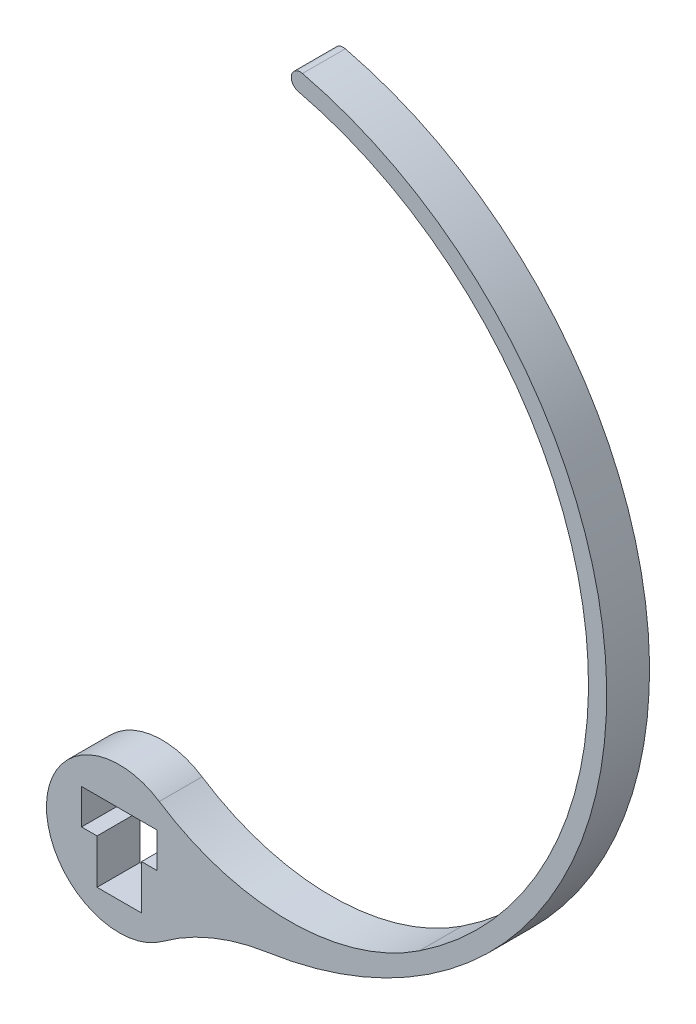
ISO-10303-21;
HEADER;
FILE_DESCRIPTION(('STEP AP214'),'2;1');
FILE_NAME('part.step','',(''),(''),'','','');
FILE_SCHEMA(('AUTOMOTIVE_DESIGN { 1 0 10303 214 1 1 1 1 }'));
ENDSEC;
DATA;
#1=APPLICATION_CONTEXT('core data for automotive mechanical design processes');
#2=APPLICATION_PROTOCOL_DEFINITION('international standard','automotive_design',2000,#1);
#3=PRODUCT_CONTEXT('',#1,'mechanical');
#4=PRODUCT('Part','Part','',(#3));
#5=PRODUCT_RELATED_PRODUCT_CATEGORY('part','',(#4));
#6=PRODUCT_DEFINITION_FORMATION('','',#4);
#7=PRODUCT_DEFINITION_CONTEXT('part definition',#1,'design');
#8=PRODUCT_DEFINITION('design','',#6,#7);
#9=PRODUCT_DEFINITION_SHAPE('','',#8);
#10=(LENGTH_UNIT() NAMED_UNIT(*) SI_UNIT(.MILLI.,.METRE.));
#11=(NAMED_UNIT(*) PLANE_ANGLE_UNIT() SI_UNIT($,.RADIAN.));
#12=(NAMED_UNIT(*) SI_UNIT($,.STERADIAN.) SOLID_ANGLE_UNIT());
#13=UNCERTAINTY_MEASURE_WITH_UNIT(LENGTH_MEASURE(1.E-05),#10,'distance_accuracy_value','');
#14=(GEOMETRIC_REPRESENTATION_CONTEXT(3) GLOBAL_UNCERTAINTY_ASSIGNED_CONTEXT((#13)) GLOBAL_UNIT_ASSIGNED_CONTEXT((#10,
#11,#12)) REPRESENTATION_CONTEXT('',''));
#15=CARTESIAN_POINT('',(0.,0.,0.));
#16=DIRECTION('',(0.,0.,1.));
#17=DIRECTION('',(1.,0.,0.));
#18=AXIS2_PLACEMENT_3D('',#15,#16,#17);
#19=CARTESIAN_POINT('',(0.,0.,6.35));
#20=DIRECTION('',(0.,0.,1.));
#21=DIRECTION('',(1.,0.,0.));
#22=AXIS2_PLACEMENT_3D('',#19,#20,#21);
#23=PLANE('',#22);
#24=CARTESIAN_POINT('',(13.4231084217146,55.9112704228664,6.35));
#25=DIRECTION('',(0.,0.,1.));
#26=DIRECTION('',(1.,0.,0.));
#27=AXIS2_PLACEMENT_3D('',#24,#25,#26);
#28=CIRCLE('',#27,56.15);
#29=CARTESIAN_POINT('',(44.4895028171443,9.13839752342162,6.35));
#30=VERTEX_POINT('',#29);
#31=CARTESIAN_POINT('',(26.5310656022237,110.509841453196,6.35));
#32=VERTEX_POINT('',#31);
#33=EDGE_CURVE('E206',#30,#32,#28,.T.);
#34=ORIENTED_EDGE('',*,*,#33,.F.);
#35=CARTESIAN_POINT('',(25.1248758565025,38.2933494643044,6.35));
#36=DIRECTION('',(0.,0.,1.));
#37=DIRECTION('',(1.,0.,0.));
#38=AXIS2_PLACEMENT_3D('',#35,#36,#37);
#39=CIRCLE('',#38,35.);
#40=CARTESIAN_POINT('',(5.92464321507045,9.02987279944295,6.35));
#41=VERTEX_POINT('',#40);
#42=EDGE_CURVE('E11',#30,#41,#39,.F.);
#43=ORIENTED_EDGE('',*,*,#42,.T.);
#44=CARTESIAN_POINT('',(0.,0.,6.35));
#45=DIRECTION('',(0.,0.,1.));
#46=DIRECTION('',(1.,0.,0.));
#47=AXIS2_PLACEMENT_3D('',#44,#45,#46);
#48=CIRCLE('',#47,10.8);
#49=CARTESIAN_POINT('',(6.38441607209151,-8.71086858002229,6.35));
#50=VERTEX_POINT('',#49);
#51=EDGE_CURVE('E197',#41,#50,#48,.T.);
#52=ORIENTED_EDGE('',*,*,#51,.T.);
#53=CARTESIAN_POINT('',(27.0746533427585,-36.940535274539,6.35));
#54=DIRECTION('',(0.,0.,1.));
#55=DIRECTION('',(1.,0.,0.));
#56=AXIS2_PLACEMENT_3D('',#53,#54,#55);
#57=CIRCLE('',#56,35.);
#58=CARTESIAN_POINT('',(21.9835071281976,-2.31279740123917,6.35));
#59=VERTEX_POINT('',#58);
#60=EDGE_CURVE('E234',#50,#59,#57,.F.);
#61=ORIENTED_EDGE('',*,*,#60,.T.);
#62=CARTESIAN_POINT('',(13.4231084217146,55.9112704228664,6.35));
#63=DIRECTION('',(0.,0.,1.));
#64=DIRECTION('',(1.,0.,0.));
#65=AXIS2_PLACEMENT_3D('',#62,#63,#64);
#66=CIRCLE('',#65,58.85);
#67=CARTESIAN_POINT('',(27.1613680846347,113.13524023827,6.35));
#68=VERTEX_POINT('',#67);
#69=EDGE_CURVE('E200',#59,#68,#66,.T.);
#70=ORIENTED_EDGE('',*,*,#69,.T.);
#71=CARTESIAN_POINT('',(26.8462168434292,111.822540845733,6.35));
#72=DIRECTION('',(0.,0.,1.));
#73=DIRECTION('',(1.,0.,0.));
#74=AXIS2_PLACEMENT_3D('',#71,#72,#73);
#75=CIRCLE('',#74,1.34999999999999);
#76=EDGE_CURVE('E203',#68,#32,#75,.T.);
#77=ORIENTED_EDGE('',*,*,#76,.T.);
#78=EDGE_LOOP('',(#34,#43,#52,#61,#70,#77));
#79=FACE_BOUND('',#78,.T.);
#80=DIRECTION('',(-1.,0.,0.));
#81=VECTOR('',#80,1.);
#82=CARTESIAN_POINT('',(0.,0.,6.35));
#83=LINE('',#82,#81);
#84=CARTESIAN_POINT('',(5.6,0.,6.35));
#85=VERTEX_POINT('',#84);
#86=CARTESIAN_POINT('',(3.3,0.,6.35));
#87=VERTEX_POINT('',#86);
#88=EDGE_CURVE('E169',#85,#87,#83,.T.);
#89=ORIENTED_EDGE('',*,*,#88,.T.);
#90=DIRECTION('',(0.,-1.,0.));
#91=VECTOR('',#90,1.);
#92=CARTESIAN_POINT('',(3.3,0.,6.35));
#93=LINE('',#92,#91);
#94=CARTESIAN_POINT('',(3.3,-6.6,6.35));
#95=VERTEX_POINT('',#94);
#96=EDGE_CURVE('E49',#87,#95,#93,.T.);
#97=ORIENTED_EDGE('',*,*,#96,.T.);
#98=DIRECTION('',(1.,0.,0.));
#99=VECTOR('',#98,1.);
#100=CARTESIAN_POINT('',(0.,-6.6,6.35));
#101=LINE('',#100,#99);
#102=CARTESIAN_POINT('',(-3.3,-6.6,6.35));
#103=VERTEX_POINT('',#102);
#104=EDGE_CURVE('E153',#103,#95,#101,.T.);
#105=ORIENTED_EDGE('',*,*,#104,.F.);
#106=DIRECTION('',(0.,-1.,0.));
#107=VECTOR('',#106,1.);
#108=CARTESIAN_POINT('',(-3.3,0.,6.35));
#109=LINE('',#108,#107);
#110=CARTESIAN_POINT('',(-3.3,0.,6.35));
#111=VERTEX_POINT('',#110);
#112=EDGE_CURVE('E156',#111,#103,#109,.T.);
#113=ORIENTED_EDGE('',*,*,#112,.F.);
#114=CARTESIAN_POINT('',(-5.6,0.,6.35));
#115=VERTEX_POINT('',#114);
#116=EDGE_CURVE('E172',#111,#115,#83,.T.);
#117=ORIENTED_EDGE('',*,*,#116,.T.);
#118=DIRECTION('',(0.,1.,0.));
#119=VECTOR('',#118,1.);
#120=CARTESIAN_POINT('',(-5.6,0.,6.35));
#121=LINE('',#120,#119);
#122=CARTESIAN_POINT('',(-5.6,5.2,6.35));
#123=VERTEX_POINT('',#122);
#124=EDGE_CURVE('E178',#115,#123,#121,.T.);
#125=ORIENTED_EDGE('',*,*,#124,.T.);
#126=DIRECTION('',(-1.,0.,0.));
#127=VECTOR('',#126,1.);
#128=CARTESIAN_POINT('',(0.,5.2,6.35));
#129=LINE('',#128,#127);
#130=CARTESIAN_POINT('',(5.6,5.2,6.35));
#131=VERTEX_POINT('',#130);
#132=EDGE_CURVE('E175',#131,#123,#129,.T.);
#133=ORIENTED_EDGE('',*,*,#132,.F.);
#134=DIRECTION('',(0.,1.,0.));
#135=VECTOR('',#134,1.);
#136=CARTESIAN_POINT('',(5.6,0.,6.35));
#137=LINE('',#136,#135);
#138=EDGE_CURVE('E171',#85,#131,#137,.T.);
#139=ORIENTED_EDGE('',*,*,#138,.F.);
#140=EDGE_LOOP('',(#89,#97,#105,#113,#117,#125,#133,#139));
#141=FACE_BOUND('',#140,.T.);
#142=ADVANCED_FACE('F34',(#79,#141),#23,.T.);
#143=CARTESIAN_POINT('',(0.,0.,0.));
#144=DIRECTION('',(0.,0.,1.));
#145=DIRECTION('',(1.,0.,0.));
#146=AXIS2_PLACEMENT_3D('',#143,#144,#145);
#147=PLANE('',#146);
#148=CARTESIAN_POINT('',(0.,0.,0.));
#149=DIRECTION('',(0.,0.,1.));
#150=DIRECTION('',(1.,0.,0.));
#151=AXIS2_PLACEMENT_3D('',#148,#149,#150);
#152=CIRCLE('',#151,10.8);
#153=CARTESIAN_POINT('',(5.92464321507045,9.02987279944295,0.));
#154=VERTEX_POINT('',#153);
#155=CARTESIAN_POINT('',(6.38441607209151,-8.71086858002229,0.));
#156=VERTEX_POINT('',#155);
#157=EDGE_CURVE('E185',#154,#156,#152,.T.);
#158=ORIENTED_EDGE('',*,*,#157,.F.);
#159=CARTESIAN_POINT('',(25.1248758565025,38.2933494643044,0.));
#160=DIRECTION('',(0.,0.,1.));
#161=DIRECTION('',(1.,0.,0.));
#162=AXIS2_PLACEMENT_3D('',#159,#160,#161);
#163=CIRCLE('',#162,35.);
#164=CARTESIAN_POINT('',(44.4895028171443,9.13839752342162,0.));
#165=VERTEX_POINT('',#164);
#166=EDGE_CURVE('E42',#154,#165,#163,.T.);
#167=ORIENTED_EDGE('',*,*,#166,.T.);
#168=CARTESIAN_POINT('',(13.4231084217146,55.9112704228664,0.));
#169=DIRECTION('',(0.,0.,1.));
#170=DIRECTION('',(1.,0.,0.));
#171=AXIS2_PLACEMENT_3D('',#168,#169,#170);
#172=CIRCLE('',#171,56.15);
#173=CARTESIAN_POINT('',(26.5310656022237,110.509841453196,0.));
#174=VERTEX_POINT('',#173);
#175=EDGE_CURVE('E201',#165,#174,#172,.T.);
#176=ORIENTED_EDGE('',*,*,#175,.T.);
#177=CARTESIAN_POINT('',(26.8462168434292,111.822540845733,0.));
#178=DIRECTION('',(0.,0.,1.));
#179=DIRECTION('',(1.,0.,0.));
#180=AXIS2_PLACEMENT_3D('',#177,#178,#179);
#181=CIRCLE('',#180,1.34999999999999);
#182=CARTESIAN_POINT('',(27.1613680846347,113.13524023827,0.));
#183=VERTEX_POINT('',#182);
#184=EDGE_CURVE('E213',#183,#174,#181,.T.);
#185=ORIENTED_EDGE('',*,*,#184,.F.);
#186=CARTESIAN_POINT('',(13.4231084217146,55.9112704228664,0.));
#187=DIRECTION('',(0.,0.,1.));
#188=DIRECTION('',(1.,0.,0.));
#189=AXIS2_PLACEMENT_3D('',#186,#187,#188);
#190=CIRCLE('',#189,58.85);
#191=CARTESIAN_POINT('',(21.9835071281976,-2.31279740123917,0.));
#192=VERTEX_POINT('',#191);
#193=EDGE_CURVE('E211',#192,#183,#190,.T.);
#194=ORIENTED_EDGE('',*,*,#193,.F.);
#195=CARTESIAN_POINT('',(27.0746533427585,-36.940535274539,0.));
#196=DIRECTION('',(0.,0.,1.));
#197=DIRECTION('',(1.,0.,0.));
#198=AXIS2_PLACEMENT_3D('',#195,#196,#197);
#199=CIRCLE('',#198,35.);
#200=EDGE_CURVE('E232',#192,#156,#199,.T.);
#201=ORIENTED_EDGE('',*,*,#200,.T.);
#202=EDGE_LOOP('',(#158,#167,#176,#185,#194,#201));
#203=FACE_BOUND('',#202,.T.);
#204=DIRECTION('',(0.,-1.,0.));
#205=VECTOR('',#204,1.);
#206=CARTESIAN_POINT('',(3.3,0.,0.));
#207=LINE('',#206,#205);
#208=CARTESIAN_POINT('',(3.3,0.,0.));
#209=VERTEX_POINT('',#208);
#210=CARTESIAN_POINT('',(3.3,-6.6,0.));
#211=VERTEX_POINT('',#210);
#212=EDGE_CURVE('E142',#209,#211,#207,.T.);
#213=ORIENTED_EDGE('',*,*,#212,.F.);
#214=DIRECTION('',(-1.,0.,0.));
#215=VECTOR('',#214,1.);
#216=CARTESIAN_POINT('',(0.,0.,0.));
#217=LINE('',#216,#215);
#218=CARTESIAN_POINT('',(5.6,0.,0.));
#219=VERTEX_POINT('',#218);
#220=EDGE_CURVE('E134',#219,#209,#217,.T.);
#221=ORIENTED_EDGE('',*,*,#220,.F.);
#222=DIRECTION('',(0.,1.,0.));
#223=VECTOR('',#222,1.);
#224=CARTESIAN_POINT('',(5.6,0.,0.));
#225=LINE('',#224,#223);
#226=CARTESIAN_POINT('',(5.6,5.2,0.));
#227=VERTEX_POINT('',#226);
#228=EDGE_CURVE('E57',#219,#227,#225,.T.);
#229=ORIENTED_EDGE('',*,*,#228,.T.);
#230=DIRECTION('',(-1.,0.,0.));
#231=VECTOR('',#230,1.);
#232=CARTESIAN_POINT('',(0.,5.2,0.));
#233=LINE('',#232,#231);
#234=CARTESIAN_POINT('',(-5.6,5.2,0.));
#235=VERTEX_POINT('',#234);
#236=EDGE_CURVE('E160',#227,#235,#233,.T.);
#237=ORIENTED_EDGE('',*,*,#236,.T.);
#238=DIRECTION('',(0.,1.,0.));
#239=VECTOR('',#238,1.);
#240=CARTESIAN_POINT('',(-5.6,0.,0.));
#241=LINE('',#240,#239);
#242=CARTESIAN_POINT('',(-5.6,0.,0.));
#243=VERTEX_POINT('',#242);
#244=EDGE_CURVE('E163',#243,#235,#241,.T.);
#245=ORIENTED_EDGE('',*,*,#244,.F.);
#246=CARTESIAN_POINT('',(-3.3,0.,0.));
#247=VERTEX_POINT('',#246);
#248=EDGE_CURVE('E144',#247,#243,#217,.T.);
#249=ORIENTED_EDGE('',*,*,#248,.F.);
#250=DIRECTION('',(0.,-1.,0.));
#251=VECTOR('',#250,1.);
#252=CARTESIAN_POINT('',(-3.3,0.,0.));
#253=LINE('',#252,#251);
#254=CARTESIAN_POINT('',(-3.3,-6.6,0.));
#255=VERTEX_POINT('',#254);
#256=EDGE_CURVE('E165',#247,#255,#253,.T.);
#257=ORIENTED_EDGE('',*,*,#256,.T.);
#258=DIRECTION('',(1.,0.,0.));
#259=VECTOR('',#258,1.);
#260=CARTESIAN_POINT('',(0.,-6.6,0.));
#261=LINE('',#260,#259);
#262=EDGE_CURVE('E147',#255,#211,#261,.T.);
#263=ORIENTED_EDGE('',*,*,#262,.T.);
#264=EDGE_LOOP('',(#213,#221,#229,#237,#245,#249,#257,#263));
#265=FACE_BOUND('',#264,.T.);
#266=ADVANCED_FACE('F150',(#203,#265),#147,.F.);
#267=CARTESIAN_POINT('',(0.,0.,6.35));
#268=DIRECTION('',(0.,0.,-1.));
#269=DIRECTION('',(-1.,0.,0.));
#270=AXIS2_PLACEMENT_3D('',#267,#268,#269);
#271=CYLINDRICAL_SURFACE('',#270,10.8);
#272=ORIENTED_EDGE('',*,*,#157,.T.);
#273=DIRECTION('',(0.,0.,-1.));
#274=VECTOR('',#273,1.);
#275=CARTESIAN_POINT('',(6.38441607209151,-8.71086858002229,6.35));
#276=LINE('',#275,#274);
#277=EDGE_CURVE('E228',#156,#50,#276,.F.);
#278=ORIENTED_EDGE('',*,*,#277,.T.);
#279=ORIENTED_EDGE('',*,*,#51,.F.);
#280=DIRECTION('',(0.,0.,-1.));
#281=VECTOR('',#280,1.);
#282=CARTESIAN_POINT('',(5.92464321507045,9.02987279944295,6.35));
#283=LINE('',#282,#281);
#284=EDGE_CURVE('E225',#41,#154,#283,.T.);
#285=ORIENTED_EDGE('',*,*,#284,.T.);
#286=EDGE_LOOP('',(#272,#278,#279,#285));
#287=FACE_BOUND('',#286,.T.);
#288=ADVANCED_FACE('F252',(#287),#271,.T.);
#289=CARTESIAN_POINT('',(13.4231084217146,55.9112704228664,6.35));
#290=DIRECTION('',(0.,0.,-1.));
#291=DIRECTION('',(-1.,0.,0.));
#292=AXIS2_PLACEMENT_3D('',#289,#290,#291);
#293=CYLINDRICAL_SURFACE('',#292,58.85);
#294=ORIENTED_EDGE('',*,*,#69,.F.);
#295=DIRECTION('',(0.,0.,-1.));
#296=VECTOR('',#295,1.);
#297=CARTESIAN_POINT('',(21.9835071281976,-2.31279740123917,6.35));
#298=LINE('',#297,#296);
#299=EDGE_CURVE('E222',#59,#192,#298,.T.);
#300=ORIENTED_EDGE('',*,*,#299,.T.);
#301=ORIENTED_EDGE('',*,*,#193,.T.);
#302=DIRECTION('',(0.,0.,-1.));
#303=VECTOR('',#302,1.);
#304=CARTESIAN_POINT('',(27.1613680846347,113.13524023827,6.35));
#305=LINE('',#304,#303);
#306=EDGE_CURVE('E219',#68,#183,#305,.T.);
#307=ORIENTED_EDGE('',*,*,#306,.F.);
#308=EDGE_LOOP('',(#294,#300,#301,#307));
#309=FACE_BOUND('',#308,.T.);
#310=ADVANCED_FACE('F260',(#309),#293,.T.);
#311=CARTESIAN_POINT('',(26.8462168434292,111.822540845733,6.35));
#312=DIRECTION('',(0.,0.,-1.));
#313=DIRECTION('',(-1.,0.,0.));
#314=AXIS2_PLACEMENT_3D('',#311,#312,#313);
#315=CYLINDRICAL_SURFACE('',#314,1.34999999999999);
#316=ORIENTED_EDGE('',*,*,#184,.T.);
#317=DIRECTION('',(0.,0.,-1.));
#318=VECTOR('',#317,1.);
#319=CARTESIAN_POINT('',(26.5310656022237,110.509841453196,6.35));
#320=LINE('',#319,#318);
#321=EDGE_CURVE('E208',#32,#174,#320,.T.);
#322=ORIENTED_EDGE('',*,*,#321,.F.);
#323=ORIENTED_EDGE('',*,*,#76,.F.);
#324=ORIENTED_EDGE('',*,*,#306,.T.);
#325=EDGE_LOOP('',(#316,#322,#323,#324));
#326=FACE_BOUND('',#325,.T.);
#327=ADVANCED_FACE('F264',(#326),#315,.T.);
#328=CARTESIAN_POINT('',(13.4231084217146,55.9112704228664,6.35));
#329=DIRECTION('',(0.,0.,-1.));
#330=DIRECTION('',(-1.,0.,0.));
#331=AXIS2_PLACEMENT_3D('',#328,#329,#330);
#332=CYLINDRICAL_SURFACE('',#331,56.15);
#333=ORIENTED_EDGE('',*,*,#175,.F.);
#334=DIRECTION('',(0.,0.,-1.));
#335=VECTOR('',#334,1.);
#336=CARTESIAN_POINT('',(44.4895028171443,9.13839752342161,6.35));
#337=LINE('',#336,#335);
#338=EDGE_CURVE('E230',#165,#30,#337,.F.);
#339=ORIENTED_EDGE('',*,*,#338,.T.);
#340=ORIENTED_EDGE('',*,*,#33,.T.);
#341=ORIENTED_EDGE('',*,*,#321,.T.);
#342=EDGE_LOOP('',(#333,#339,#340,#341));
#343=FACE_BOUND('',#342,.T.);
#344=ADVANCED_FACE('F243',(#343),#332,.F.);
#345=CARTESIAN_POINT('',(27.0746533427585,-36.940535274539,6.35));
#346=DIRECTION('',(0.,0.,1.));
#347=DIRECTION('',(1.,0.,0.));
#348=AXIS2_PLACEMENT_3D('',#345,#346,#347);
#349=CYLINDRICAL_SURFACE('',#348,35.);
#350=ORIENTED_EDGE('',*,*,#60,.F.);
#351=ORIENTED_EDGE('',*,*,#277,.F.);
#352=ORIENTED_EDGE('',*,*,#200,.F.);
#353=ORIENTED_EDGE('',*,*,#299,.F.);
#354=EDGE_LOOP('',(#350,#351,#352,#353));
#355=FACE_BOUND('',#354,.T.);
#356=ADVANCED_FACE('F255',(#355),#349,.F.);
#357=CARTESIAN_POINT('',(25.1248758565025,38.2933494643044,6.35));
#358=DIRECTION('',(0.,0.,-1.));
#359=DIRECTION('',(-1.,0.,0.));
#360=AXIS2_PLACEMENT_3D('',#357,#358,#359);
#361=CYLINDRICAL_SURFACE('',#360,35.);
#362=ORIENTED_EDGE('',*,*,#42,.F.);
#363=ORIENTED_EDGE('',*,*,#338,.F.);
#364=ORIENTED_EDGE('',*,*,#166,.F.);
#365=ORIENTED_EDGE('',*,*,#284,.F.);
#366=EDGE_LOOP('',(#362,#363,#364,#365));
#367=FACE_BOUND('',#366,.T.);
#368=ADVANCED_FACE('F36',(#367),#361,.F.);
#369=CARTESIAN_POINT('',(3.3,0.,0.));
#370=DIRECTION('',(-1.,0.,0.));
#371=DIRECTION('',(0.,0.,1.));
#372=AXIS2_PLACEMENT_3D('',#369,#370,#371);
#373=PLANE('',#372);
#374=ORIENTED_EDGE('',*,*,#96,.F.);
#375=DIRECTION('',(0.,0.,1.));
#376=VECTOR('',#375,1.);
#377=CARTESIAN_POINT('',(3.3,0.,0.));
#378=LINE('',#377,#376);
#379=EDGE_CURVE('E137',#209,#87,#378,.T.);
#380=ORIENTED_EDGE('',*,*,#379,.F.);
#381=ORIENTED_EDGE('',*,*,#212,.T.);
#382=DIRECTION('',(0.,0.,1.));
#383=VECTOR('',#382,1.);
#384=CARTESIAN_POINT('',(3.3,-6.6,0.));
#385=LINE('',#384,#383);
#386=EDGE_CURVE('E183',#211,#95,#385,.T.);
#387=ORIENTED_EDGE('',*,*,#386,.T.);
#388=EDGE_LOOP('',(#374,#380,#381,#387));
#389=FACE_BOUND('',#388,.T.);
#390=ADVANCED_FACE('F145',(#389),#373,.T.);
#391=CARTESIAN_POINT('',(0.,-6.6,0.));
#392=DIRECTION('',(0.,-1.,0.));
#393=DIRECTION('',(0.,0.,-1.));
#394=AXIS2_PLACEMENT_3D('',#391,#392,#393);
#395=PLANE('',#394);
#396=ORIENTED_EDGE('',*,*,#104,.T.);
#397=ORIENTED_EDGE('',*,*,#386,.F.);
#398=ORIENTED_EDGE('',*,*,#262,.F.);
#399=DIRECTION('',(0.,0.,1.));
#400=VECTOR('',#399,1.);
#401=CARTESIAN_POINT('',(-3.3,-6.6,0.));
#402=LINE('',#401,#400);
#403=EDGE_CURVE('E186',#255,#103,#402,.T.);
#404=ORIENTED_EDGE('',*,*,#403,.T.);
#405=EDGE_LOOP('',(#396,#397,#398,#404));
#406=FACE_BOUND('',#405,.T.);
#407=ADVANCED_FACE('F283',(#406),#395,.F.);
#408=CARTESIAN_POINT('',(-3.3,0.,0.));
#409=DIRECTION('',(-1.,0.,0.));
#410=DIRECTION('',(0.,0.,1.));
#411=AXIS2_PLACEMENT_3D('',#408,#409,#410);
#412=PLANE('',#411);
#413=ORIENTED_EDGE('',*,*,#112,.T.);
#414=ORIENTED_EDGE('',*,*,#403,.F.);
#415=ORIENTED_EDGE('',*,*,#256,.F.);
#416=DIRECTION('',(0.,0.,1.));
#417=VECTOR('',#416,1.);
#418=CARTESIAN_POINT('',(-3.3,0.,0.));
#419=LINE('',#418,#417);
#420=EDGE_CURVE('E188',#247,#111,#419,.T.);
#421=ORIENTED_EDGE('',*,*,#420,.T.);
#422=EDGE_LOOP('',(#413,#414,#415,#421));
#423=FACE_BOUND('',#422,.T.);
#424=ADVANCED_FACE('F298',(#423),#412,.F.);
#425=CARTESIAN_POINT('',(0.,0.,0.));
#426=DIRECTION('',(0.,1.,0.));
#427=DIRECTION('',(-1.,0.,0.));
#428=AXIS2_PLACEMENT_3D('',#425,#426,#427);
#429=PLANE('',#428);
#430=ORIENTED_EDGE('',*,*,#116,.F.);
#431=ORIENTED_EDGE('',*,*,#420,.F.);
#432=ORIENTED_EDGE('',*,*,#248,.T.);
#433=DIRECTION('',(0.,0.,1.));
#434=VECTOR('',#433,1.);
#435=CARTESIAN_POINT('',(-5.6,0.,0.));
#436=LINE('',#435,#434);
#437=EDGE_CURVE('E190',#243,#115,#436,.T.);
#438=ORIENTED_EDGE('',*,*,#437,.T.);
#439=EDGE_LOOP('',(#430,#431,#432,#438));
#440=FACE_BOUND('',#439,.T.);
#441=ADVANCED_FACE('F294',(#440),#429,.T.);
#442=CARTESIAN_POINT('',(-5.6,0.,0.));
#443=DIRECTION('',(1.,0.,0.));
#444=DIRECTION('',(0.,1.,0.));
#445=AXIS2_PLACEMENT_3D('',#442,#443,#444);
#446=PLANE('',#445);
#447=ORIENTED_EDGE('',*,*,#124,.F.);
#448=ORIENTED_EDGE('',*,*,#437,.F.);
#449=ORIENTED_EDGE('',*,*,#244,.T.);
#450=DIRECTION('',(0.,0.,1.));
#451=VECTOR('',#450,1.);
#452=CARTESIAN_POINT('',(-5.6,5.2,0.));
#453=LINE('',#452,#451);
#454=EDGE_CURVE('E192',#235,#123,#453,.T.);
#455=ORIENTED_EDGE('',*,*,#454,.T.);
#456=EDGE_LOOP('',(#447,#448,#449,#455));
#457=FACE_BOUND('',#456,.T.);
#458=ADVANCED_FACE('F290',(#457),#446,.T.);
#459=CARTESIAN_POINT('',(0.,5.2,0.));
#460=DIRECTION('',(0.,1.,0.));
#461=DIRECTION('',(-1.,0.,0.));
#462=AXIS2_PLACEMENT_3D('',#459,#460,#461);
#463=PLANE('',#462);
#464=ORIENTED_EDGE('',*,*,#132,.T.);
#465=ORIENTED_EDGE('',*,*,#454,.F.);
#466=ORIENTED_EDGE('',*,*,#236,.F.);
#467=DIRECTION('',(0.,0.,1.));
#468=VECTOR('',#467,1.);
#469=CARTESIAN_POINT('',(5.6,5.2,0.));
#470=LINE('',#469,#468);
#471=EDGE_CURVE('E194',#227,#131,#470,.T.);
#472=ORIENTED_EDGE('',*,*,#471,.T.);
#473=EDGE_LOOP('',(#464,#465,#466,#472));
#474=FACE_BOUND('',#473,.T.);
#475=ADVANCED_FACE('F287',(#474),#463,.F.);
#476=CARTESIAN_POINT('',(5.6,0.,0.));
#477=DIRECTION('',(1.,0.,0.));
#478=DIRECTION('',(0.,1.,0.));
#479=AXIS2_PLACEMENT_3D('',#476,#477,#478);
#480=PLANE('',#479);
#481=ORIENTED_EDGE('',*,*,#138,.T.);
#482=ORIENTED_EDGE('',*,*,#471,.F.);
#483=ORIENTED_EDGE('',*,*,#228,.F.);
#484=DIRECTION('',(0.,0.,1.));
#485=VECTOR('',#484,1.);
#486=CARTESIAN_POINT('',(5.6,0.,0.));
#487=LINE('',#486,#485);
#488=EDGE_CURVE('E139',#219,#85,#487,.T.);
#489=ORIENTED_EDGE('',*,*,#488,.T.);
#490=EDGE_LOOP('',(#481,#482,#483,#489));
#491=FACE_BOUND('',#490,.T.);
#492=ADVANCED_FACE('F284',(#491),#480,.F.);
#493=ORIENTED_EDGE('',*,*,#88,.F.);
#494=ORIENTED_EDGE('',*,*,#488,.F.);
#495=ORIENTED_EDGE('',*,*,#220,.T.);
#496=ORIENTED_EDGE('',*,*,#379,.T.);
#497=EDGE_LOOP('',(#493,#494,#495,#496));
#498=FACE_BOUND('',#497,.T.);
#499=ADVANCED_FACE('F136',(#498),#429,.T.);
#500=CLOSED_SHELL('',(#142,#266,#288,#310,#327,#344,#356,#368,#390,#407,#424,#441,#458,#475,
#492,#499));
#501=MANIFOLD_SOLID_BREP('B2',#500);
#502=ADVANCED_BREP_SHAPE_REPRESENTATION('',(#18,#501),#14);
#503=SHAPE_DEFINITION_REPRESENTATION(#9,#502);
ENDSEC;
END-ISO-10303-21;
